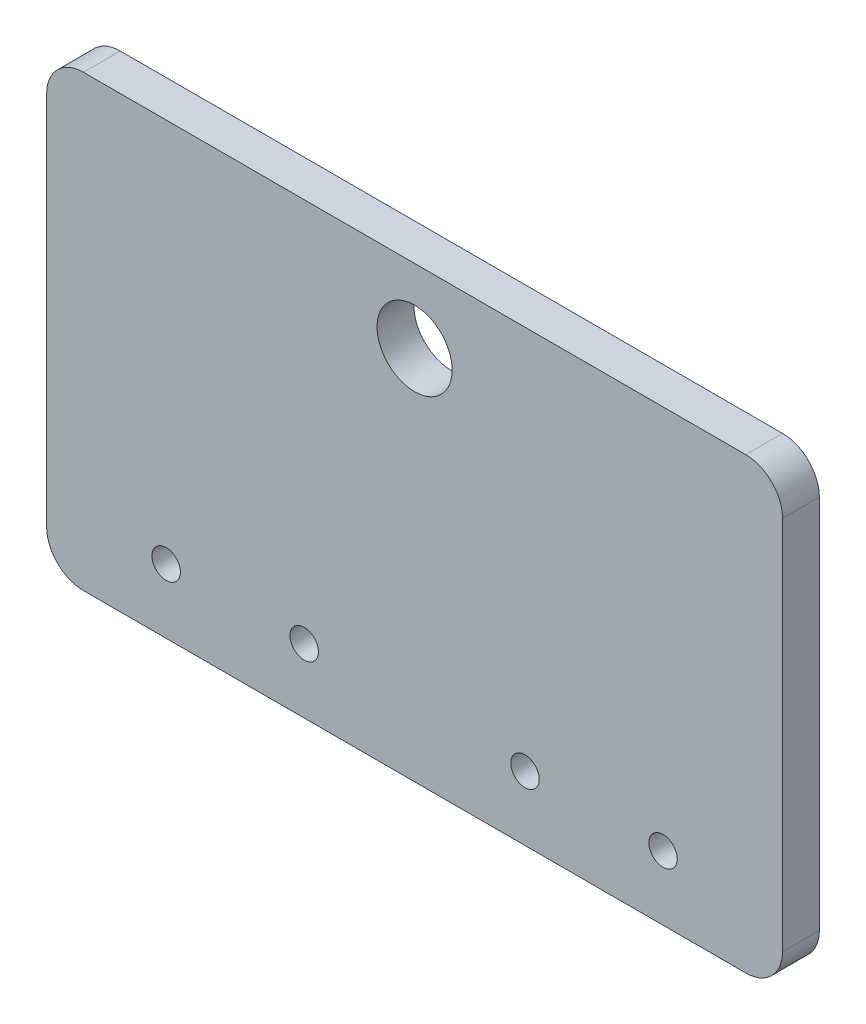
ISO-10303-21;
HEADER;
FILE_DESCRIPTION(('STEP AP214'),'2;1');
FILE_NAME('part.step','',(''),(''),'','','');
FILE_SCHEMA(('AUTOMOTIVE_DESIGN { 1 0 10303 214 1 1 1 1 }'));
ENDSEC;
DATA;
#1=APPLICATION_CONTEXT('core data for automotive mechanical design processes');
#2=APPLICATION_PROTOCOL_DEFINITION('international standard','automotive_design',2000,#1);
#3=PRODUCT_CONTEXT('',#1,'mechanical');
#4=PRODUCT('Part','Part','',(#3));
#5=PRODUCT_RELATED_PRODUCT_CATEGORY('part','',(#4));
#6=PRODUCT_DEFINITION_FORMATION('','',#4);
#7=PRODUCT_DEFINITION_CONTEXT('part definition',#1,'design');
#8=PRODUCT_DEFINITION('design','',#6,#7);
#9=PRODUCT_DEFINITION_SHAPE('','',#8);
#10=(LENGTH_UNIT() NAMED_UNIT(*) SI_UNIT(.MILLI.,.METRE.));
#11=(NAMED_UNIT(*) PLANE_ANGLE_UNIT() SI_UNIT($,.RADIAN.));
#12=(NAMED_UNIT(*) SI_UNIT($,.STERADIAN.) SOLID_ANGLE_UNIT());
#13=UNCERTAINTY_MEASURE_WITH_UNIT(LENGTH_MEASURE(1.E-05),#10,'distance_accuracy_value','');
#14=(GEOMETRIC_REPRESENTATION_CONTEXT(3) GLOBAL_UNCERTAINTY_ASSIGNED_CONTEXT((#13)) GLOBAL_UNIT_ASSIGNED_CONTEXT((#10,
#11,#12)) REPRESENTATION_CONTEXT('',''));
#15=CARTESIAN_POINT('',(0.,0.,0.));
#16=DIRECTION('',(0.,0.,1.));
#17=DIRECTION('',(1.,0.,0.));
#18=AXIS2_PLACEMENT_3D('',#15,#16,#17);
#19=CARTESIAN_POINT('',(0.,0.,0.));
#20=DIRECTION('',(0.,0.,-1.));
#21=DIRECTION('',(-1.,0.,0.));
#22=AXIS2_PLACEMENT_3D('',#19,#20,#21);
#23=PLANE('',#22);
#24=CARTESIAN_POINT('',(63.5,64.77,0.));
#25=DIRECTION('',(0.,0.,1.));
#26=DIRECTION('',(1.,0.,0.));
#27=AXIS2_PLACEMENT_3D('',#24,#25,#26);
#28=CIRCLE('',#27,6.477);
#29=CARTESIAN_POINT('',(69.977,64.77,0.));
#30=VERTEX_POINT('',#29);
#31=EDGE_CURVE('E210',#30,#30,#28,.T.);
#32=ORIENTED_EDGE('',*,*,#31,.T.);
#33=EDGE_LOOP('',(#32));
#34=FACE_BOUND('',#33,.T.);
#35=CARTESIAN_POINT('',(20.6248,11.1125,0.));
#36=DIRECTION('',(0.,0.,1.));
#37=DIRECTION('',(1.,0.,0.));
#38=AXIS2_PLACEMENT_3D('',#35,#36,#37);
#39=CIRCLE('',#38,2.45745);
#40=CARTESIAN_POINT('',(23.08225,11.1125,0.));
#41=VERTEX_POINT('',#40);
#42=EDGE_CURVE('E204',#41,#41,#39,.T.);
#43=ORIENTED_EDGE('',*,*,#42,.T.);
#44=EDGE_LOOP('',(#43));
#45=FACE_BOUND('',#44,.T.);
#46=DIRECTION('',(0.,1.,0.));
#47=VECTOR('',#46,1.);
#48=CARTESIAN_POINT('',(127.,77.47,0.));
#49=LINE('',#48,#47);
#50=CARTESIAN_POINT('',(127.,6.34999999999999,0.));
#51=VERTEX_POINT('',#50);
#52=CARTESIAN_POINT('',(127.,71.12,0.));
#53=VERTEX_POINT('',#52);
#54=EDGE_CURVE('E127',#51,#53,#49,.T.);
#55=ORIENTED_EDGE('',*,*,#54,.F.);
#56=CARTESIAN_POINT('',(120.65,6.34999999999999,0.));
#57=DIRECTION('',(0.,0.,-1.));
#58=DIRECTION('',(-1.,0.,0.));
#59=AXIS2_PLACEMENT_3D('',#56,#57,#58);
#60=CIRCLE('',#59,6.35);
#61=CARTESIAN_POINT('',(120.65,0.,0.));
#62=VERTEX_POINT('',#61);
#63=EDGE_CURVE('E110',#51,#62,#60,.T.);
#64=ORIENTED_EDGE('',*,*,#63,.T.);
#65=DIRECTION('',(1.,0.,0.));
#66=VECTOR('',#65,1.);
#67=CARTESIAN_POINT('',(127.,0.,0.));
#68=LINE('',#67,#66);
#69=CARTESIAN_POINT('',(6.34999999999999,0.,0.));
#70=VERTEX_POINT('',#69);
#71=EDGE_CURVE('E136',#70,#62,#68,.T.);
#72=ORIENTED_EDGE('',*,*,#71,.F.);
#73=CARTESIAN_POINT('',(6.34999999999999,6.35,0.));
#74=DIRECTION('',(0.,0.,-1.));
#75=DIRECTION('',(-1.,0.,0.));
#76=AXIS2_PLACEMENT_3D('',#73,#74,#75);
#77=CIRCLE('',#76,6.35);
#78=CARTESIAN_POINT('',(0.,6.34999999999999,0.));
#79=VERTEX_POINT('',#78);
#80=EDGE_CURVE('E130',#70,#79,#77,.T.);
#81=ORIENTED_EDGE('',*,*,#80,.T.);
#82=DIRECTION('',(0.,-1.,0.));
#83=VECTOR('',#82,1.);
#84=CARTESIAN_POINT('',(0.,77.47,0.));
#85=LINE('',#84,#83);
#86=CARTESIAN_POINT('',(0.,71.12,0.));
#87=VERTEX_POINT('',#86);
#88=EDGE_CURVE('E140',#87,#79,#85,.T.);
#89=ORIENTED_EDGE('',*,*,#88,.F.);
#90=CARTESIAN_POINT('',(6.35,71.12,0.));
#91=DIRECTION('',(0.,0.,-1.));
#92=DIRECTION('',(-1.,0.,0.));
#93=AXIS2_PLACEMENT_3D('',#90,#91,#92);
#94=CIRCLE('',#93,6.35);
#95=CARTESIAN_POINT('',(6.34999999999999,77.47,0.));
#96=VERTEX_POINT('',#95);
#97=EDGE_CURVE('E147',#87,#96,#94,.T.);
#98=ORIENTED_EDGE('',*,*,#97,.T.);
#99=DIRECTION('',(-1.,0.,0.));
#100=VECTOR('',#99,1.);
#101=CARTESIAN_POINT('',(127.,77.47,0.));
#102=LINE('',#101,#100);
#103=CARTESIAN_POINT('',(120.65,77.47,0.));
#104=VERTEX_POINT('',#103);
#105=EDGE_CURVE('E135',#104,#96,#102,.T.);
#106=ORIENTED_EDGE('',*,*,#105,.F.);
#107=CARTESIAN_POINT('',(120.65,71.12,0.));
#108=DIRECTION('',(0.,0.,-1.));
#109=DIRECTION('',(-1.,0.,0.));
#110=AXIS2_PLACEMENT_3D('',#107,#108,#109);
#111=CIRCLE('',#110,6.35);
#112=EDGE_CURVE('E121',#104,#53,#111,.T.);
#113=ORIENTED_EDGE('',*,*,#112,.T.);
#114=EDGE_LOOP('',(#55,#64,#72,#81,#89,#98,#106,#113));
#115=FACE_BOUND('',#114,.T.);
#116=CARTESIAN_POINT('',(106.3752,11.1125,0.));
#117=DIRECTION('',(0.,0.,1.));
#118=DIRECTION('',(1.,0.,0.));
#119=AXIS2_PLACEMENT_3D('',#116,#117,#118);
#120=CIRCLE('',#119,2.45745);
#121=CARTESIAN_POINT('',(108.83265,11.1125,0.));
#122=VERTEX_POINT('',#121);
#123=EDGE_CURVE('E182',#122,#122,#120,.T.);
#124=ORIENTED_EDGE('',*,*,#123,.T.);
#125=EDGE_LOOP('',(#124));
#126=FACE_BOUND('',#125,.T.);
#127=CARTESIAN_POINT('',(82.55,11.1125,0.));
#128=DIRECTION('',(0.,0.,1.));
#129=DIRECTION('',(1.,0.,0.));
#130=AXIS2_PLACEMENT_3D('',#127,#128,#129);
#131=CIRCLE('',#130,2.45745);
#132=CARTESIAN_POINT('',(85.00745,11.1125,0.));
#133=VERTEX_POINT('',#132);
#134=EDGE_CURVE('E192',#133,#133,#131,.T.);
#135=ORIENTED_EDGE('',*,*,#134,.T.);
#136=EDGE_LOOP('',(#135));
#137=FACE_BOUND('',#136,.T.);
#138=CARTESIAN_POINT('',(44.45,11.1125,0.));
#139=DIRECTION('',(0.,0.,1.));
#140=DIRECTION('',(1.,0.,0.));
#141=AXIS2_PLACEMENT_3D('',#138,#139,#140);
#142=CIRCLE('',#141,2.45745);
#143=CARTESIAN_POINT('',(46.90745,11.1125,0.));
#144=VERTEX_POINT('',#143);
#145=EDGE_CURVE('E198',#144,#144,#142,.T.);
#146=ORIENTED_EDGE('',*,*,#145,.T.);
#147=EDGE_LOOP('',(#146));
#148=FACE_BOUND('',#147,.T.);
#149=ADVANCED_FACE('F43',(#34,#45,#115,#126,#137,#148),#23,.T.);
#150=CARTESIAN_POINT('',(0.,77.47,6.35));
#151=DIRECTION('',(1.,0.,0.));
#152=DIRECTION('',(0.,1.,0.));
#153=AXIS2_PLACEMENT_3D('',#150,#151,#152);
#154=PLANE('',#153);
#155=DIRECTION('',(0.,-1.,0.));
#156=VECTOR('',#155,1.);
#157=CARTESIAN_POINT('',(0.,77.47,6.35));
#158=LINE('',#157,#156);
#159=CARTESIAN_POINT('',(0.,71.12,6.35));
#160=VERTEX_POINT('',#159);
#161=CARTESIAN_POINT('',(0.,6.34999999999999,6.35));
#162=VERTEX_POINT('',#161);
#163=EDGE_CURVE('E138',#160,#162,#158,.T.);
#164=ORIENTED_EDGE('',*,*,#163,.F.);
#165=DIRECTION('',(0.,0.,-1.));
#166=VECTOR('',#165,1.);
#167=CARTESIAN_POINT('',(0.,71.12,6.35));
#168=LINE('',#167,#166);
#169=EDGE_CURVE('E11',#160,#87,#168,.T.);
#170=ORIENTED_EDGE('',*,*,#169,.T.);
#171=ORIENTED_EDGE('',*,*,#88,.T.);
#172=DIRECTION('',(0.,0.,-1.));
#173=VECTOR('',#172,1.);
#174=CARTESIAN_POINT('',(0.,6.34999999999999,6.35));
#175=LINE('',#174,#173);
#176=EDGE_CURVE('E51',#79,#162,#175,.F.);
#177=ORIENTED_EDGE('',*,*,#176,.T.);
#178=EDGE_LOOP('',(#164,#170,#171,#177));
#179=FACE_BOUND('',#178,.T.);
#180=ADVANCED_FACE('F168',(#179),#154,.F.);
#181=CARTESIAN_POINT('',(127.,0.,6.35));
#182=DIRECTION('',(0.,1.,0.));
#183=DIRECTION('',(-1.,0.,0.));
#184=AXIS2_PLACEMENT_3D('',#181,#182,#183);
#185=PLANE('',#184);
#186=ORIENTED_EDGE('',*,*,#71,.T.);
#187=DIRECTION('',(0.,0.,-1.));
#188=VECTOR('',#187,1.);
#189=CARTESIAN_POINT('',(120.65,0.,6.35));
#190=LINE('',#189,#188);
#191=CARTESIAN_POINT('',(120.65,0.,6.35));
#192=VERTEX_POINT('',#191);
#193=EDGE_CURVE('E115',#62,#192,#190,.F.);
#194=ORIENTED_EDGE('',*,*,#193,.T.);
#195=DIRECTION('',(1.,0.,0.));
#196=VECTOR('',#195,1.);
#197=CARTESIAN_POINT('',(127.,0.,6.35));
#198=LINE('',#197,#196);
#199=CARTESIAN_POINT('',(6.34999999999999,0.,6.35));
#200=VERTEX_POINT('',#199);
#201=EDGE_CURVE('E177',#200,#192,#198,.T.);
#202=ORIENTED_EDGE('',*,*,#201,.F.);
#203=DIRECTION('',(0.,0.,-1.));
#204=VECTOR('',#203,1.);
#205=CARTESIAN_POINT('',(6.34999999999999,0.,6.35));
#206=LINE('',#205,#204);
#207=EDGE_CURVE('E120',#200,#70,#206,.T.);
#208=ORIENTED_EDGE('',*,*,#207,.T.);
#209=EDGE_LOOP('',(#186,#194,#202,#208));
#210=FACE_BOUND('',#209,.T.);
#211=ADVANCED_FACE('F181',(#210),#185,.F.);
#212=CARTESIAN_POINT('',(127.,77.47,6.35));
#213=DIRECTION('',(-1.,0.,0.));
#214=DIRECTION('',(0.,0.,1.));
#215=AXIS2_PLACEMENT_3D('',#212,#213,#214);
#216=PLANE('',#215);
#217=DIRECTION('',(0.,1.,0.));
#218=VECTOR('',#217,1.);
#219=CARTESIAN_POINT('',(127.,77.47,6.35));
#220=LINE('',#219,#218);
#221=CARTESIAN_POINT('',(127.,6.34999999999999,6.35));
#222=VERTEX_POINT('',#221);
#223=CARTESIAN_POINT('',(127.,71.12,6.35));
#224=VERTEX_POINT('',#223);
#225=EDGE_CURVE('E129',#222,#224,#220,.T.);
#226=ORIENTED_EDGE('',*,*,#225,.F.);
#227=DIRECTION('',(0.,0.,-1.));
#228=VECTOR('',#227,1.);
#229=CARTESIAN_POINT('',(127.,6.34999999999999,6.35));
#230=LINE('',#229,#228);
#231=EDGE_CURVE('E114',#222,#51,#230,.T.);
#232=ORIENTED_EDGE('',*,*,#231,.T.);
#233=ORIENTED_EDGE('',*,*,#54,.T.);
#234=DIRECTION('',(0.,0.,-1.));
#235=VECTOR('',#234,1.);
#236=CARTESIAN_POINT('',(127.,71.12,6.35));
#237=LINE('',#236,#235);
#238=EDGE_CURVE('E131',#53,#224,#237,.F.);
#239=ORIENTED_EDGE('',*,*,#238,.T.);
#240=EDGE_LOOP('',(#226,#232,#233,#239));
#241=FACE_BOUND('',#240,.T.);
#242=ADVANCED_FACE('F126',(#241),#216,.F.);
#243=CARTESIAN_POINT('',(127.,77.47,6.35));
#244=DIRECTION('',(0.,-1.,0.));
#245=DIRECTION('',(1.,0.,0.));
#246=AXIS2_PLACEMENT_3D('',#243,#244,#245);
#247=PLANE('',#246);
#248=DIRECTION('',(-1.,0.,0.));
#249=VECTOR('',#248,1.);
#250=CARTESIAN_POINT('',(127.,77.47,6.35));
#251=LINE('',#250,#249);
#252=CARTESIAN_POINT('',(120.65,77.47,6.35));
#253=VERTEX_POINT('',#252);
#254=CARTESIAN_POINT('',(6.34999999999999,77.47,6.35));
#255=VERTEX_POINT('',#254);
#256=EDGE_CURVE('E144',#253,#255,#251,.T.);
#257=ORIENTED_EDGE('',*,*,#256,.F.);
#258=DIRECTION('',(0.,0.,-1.));
#259=VECTOR('',#258,1.);
#260=CARTESIAN_POINT('',(120.65,77.47,6.35));
#261=LINE('',#260,#259);
#262=EDGE_CURVE('E161',#253,#104,#261,.T.);
#263=ORIENTED_EDGE('',*,*,#262,.T.);
#264=ORIENTED_EDGE('',*,*,#105,.T.);
#265=DIRECTION('',(0.,0.,-1.));
#266=VECTOR('',#265,1.);
#267=CARTESIAN_POINT('',(6.34999999999999,77.47,6.35));
#268=LINE('',#267,#266);
#269=EDGE_CURVE('E58',#96,#255,#268,.F.);
#270=ORIENTED_EDGE('',*,*,#269,.T.);
#271=EDGE_LOOP('',(#257,#263,#264,#270));
#272=FACE_BOUND('',#271,.T.);
#273=ADVANCED_FACE('F228',(#272),#247,.F.);
#274=CARTESIAN_POINT('',(0.,0.,6.35));
#275=DIRECTION('',(0.,0.,-1.));
#276=DIRECTION('',(-1.,0.,0.));
#277=AXIS2_PLACEMENT_3D('',#274,#275,#276);
#278=PLANE('',#277);
#279=CARTESIAN_POINT('',(63.5,64.77,6.35));
#280=DIRECTION('',(0.,0.,1.));
#281=DIRECTION('',(1.,0.,0.));
#282=AXIS2_PLACEMENT_3D('',#279,#280,#281);
#283=CIRCLE('',#282,6.477);
#284=CARTESIAN_POINT('',(69.977,64.77,6.35));
#285=VERTEX_POINT('',#284);
#286=EDGE_CURVE('E211',#285,#285,#283,.T.);
#287=ORIENTED_EDGE('',*,*,#286,.F.);
#288=EDGE_LOOP('',(#287));
#289=FACE_BOUND('',#288,.T.);
#290=CARTESIAN_POINT('',(20.6248,11.1125,6.35));
#291=DIRECTION('',(0.,0.,1.));
#292=DIRECTION('',(1.,0.,0.));
#293=AXIS2_PLACEMENT_3D('',#290,#291,#292);
#294=CIRCLE('',#293,2.45745);
#295=CARTESIAN_POINT('',(23.08225,11.1125,6.35));
#296=VERTEX_POINT('',#295);
#297=EDGE_CURVE('E207',#296,#296,#294,.T.);
#298=ORIENTED_EDGE('',*,*,#297,.F.);
#299=EDGE_LOOP('',(#298));
#300=FACE_BOUND('',#299,.T.);
#301=CARTESIAN_POINT('',(44.45,11.1125,6.35));
#302=DIRECTION('',(0.,0.,1.));
#303=DIRECTION('',(1.,0.,0.));
#304=AXIS2_PLACEMENT_3D('',#301,#302,#303);
#305=CIRCLE('',#304,2.45745);
#306=CARTESIAN_POINT('',(46.90745,11.1125,6.35));
#307=VERTEX_POINT('',#306);
#308=EDGE_CURVE('E201',#307,#307,#305,.T.);
#309=ORIENTED_EDGE('',*,*,#308,.F.);
#310=EDGE_LOOP('',(#309));
#311=FACE_BOUND('',#310,.T.);
#312=CARTESIAN_POINT('',(82.55,11.1125,6.35));
#313=DIRECTION('',(0.,0.,1.));
#314=DIRECTION('',(1.,0.,0.));
#315=AXIS2_PLACEMENT_3D('',#312,#313,#314);
#316=CIRCLE('',#315,2.45745);
#317=CARTESIAN_POINT('',(85.00745,11.1125,6.35));
#318=VERTEX_POINT('',#317);
#319=EDGE_CURVE('E195',#318,#318,#316,.T.);
#320=ORIENTED_EDGE('',*,*,#319,.F.);
#321=EDGE_LOOP('',(#320));
#322=FACE_BOUND('',#321,.T.);
#323=CARTESIAN_POINT('',(106.3752,11.1125,6.35));
#324=DIRECTION('',(0.,0.,1.));
#325=DIRECTION('',(1.,0.,0.));
#326=AXIS2_PLACEMENT_3D('',#323,#324,#325);
#327=CIRCLE('',#326,2.45745);
#328=CARTESIAN_POINT('',(108.83265,11.1125,6.35));
#329=VERTEX_POINT('',#328);
#330=EDGE_CURVE('E184',#329,#329,#327,.T.);
#331=ORIENTED_EDGE('',*,*,#330,.F.);
#332=EDGE_LOOP('',(#331));
#333=FACE_BOUND('',#332,.T.);
#334=ORIENTED_EDGE('',*,*,#201,.T.);
#335=CARTESIAN_POINT('',(120.65,6.34999999999999,6.35));
#336=DIRECTION('',(0.,0.,-1.));
#337=DIRECTION('',(-1.,0.,0.));
#338=AXIS2_PLACEMENT_3D('',#335,#336,#337);
#339=CIRCLE('',#338,6.35);
#340=EDGE_CURVE('E158',#192,#222,#339,.F.);
#341=ORIENTED_EDGE('',*,*,#340,.T.);
#342=ORIENTED_EDGE('',*,*,#225,.T.);
#343=CARTESIAN_POINT('',(120.65,71.12,6.35));
#344=DIRECTION('',(0.,0.,-1.));
#345=DIRECTION('',(-1.,0.,0.));
#346=AXIS2_PLACEMENT_3D('',#343,#344,#345);
#347=CIRCLE('',#346,6.35);
#348=EDGE_CURVE('E65',#224,#253,#347,.F.);
#349=ORIENTED_EDGE('',*,*,#348,.T.);
#350=ORIENTED_EDGE('',*,*,#256,.T.);
#351=CARTESIAN_POINT('',(6.35,71.12,6.35));
#352=DIRECTION('',(0.,0.,-1.));
#353=DIRECTION('',(-1.,0.,0.));
#354=AXIS2_PLACEMENT_3D('',#351,#352,#353);
#355=CIRCLE('',#354,6.35);
#356=EDGE_CURVE('E155',#255,#160,#355,.F.);
#357=ORIENTED_EDGE('',*,*,#356,.T.);
#358=ORIENTED_EDGE('',*,*,#163,.T.);
#359=CARTESIAN_POINT('',(6.34999999999999,6.35,6.35));
#360=DIRECTION('',(0.,0.,-1.));
#361=DIRECTION('',(-1.,0.,0.));
#362=AXIS2_PLACEMENT_3D('',#359,#360,#361);
#363=CIRCLE('',#362,6.35);
#364=EDGE_CURVE('E153',#162,#200,#363,.F.);
#365=ORIENTED_EDGE('',*,*,#364,.T.);
#366=EDGE_LOOP('',(#334,#341,#342,#349,#350,#357,#358,#365));
#367=FACE_BOUND('',#366,.T.);
#368=ADVANCED_FACE('F174',(#289,#300,#311,#322,#333,#367),#278,.F.);
#369=CARTESIAN_POINT('',(106.3752,11.1125,6.35));
#370=DIRECTION('',(0.,0.,1.));
#371=DIRECTION('',(1.,0.,0.));
#372=AXIS2_PLACEMENT_3D('',#369,#370,#371);
#373=CYLINDRICAL_SURFACE('',#372,2.45745);
#374=ORIENTED_EDGE('',*,*,#123,.F.);
#375=EDGE_LOOP('',(#374));
#376=FACE_BOUND('',#375,.T.);
#377=ORIENTED_EDGE('',*,*,#330,.T.);
#378=EDGE_LOOP('',(#377));
#379=FACE_BOUND('',#378,.T.);
#380=ADVANCED_FACE('F227',(#376,#379),#373,.F.);
#381=CARTESIAN_POINT('',(82.55,11.1125,6.35));
#382=DIRECTION('',(0.,0.,1.));
#383=DIRECTION('',(1.,0.,0.));
#384=AXIS2_PLACEMENT_3D('',#381,#382,#383);
#385=CYLINDRICAL_SURFACE('',#384,2.45745);
#386=ORIENTED_EDGE('',*,*,#134,.F.);
#387=EDGE_LOOP('',(#386));
#388=FACE_BOUND('',#387,.T.);
#389=ORIENTED_EDGE('',*,*,#319,.T.);
#390=EDGE_LOOP('',(#389));
#391=FACE_BOUND('',#390,.T.);
#392=ADVANCED_FACE('F239',(#388,#391),#385,.F.);
#393=CARTESIAN_POINT('',(44.45,11.1125,6.35));
#394=DIRECTION('',(0.,0.,1.));
#395=DIRECTION('',(1.,0.,0.));
#396=AXIS2_PLACEMENT_3D('',#393,#394,#395);
#397=CYLINDRICAL_SURFACE('',#396,2.45745);
#398=ORIENTED_EDGE('',*,*,#145,.F.);
#399=EDGE_LOOP('',(#398));
#400=FACE_BOUND('',#399,.T.);
#401=ORIENTED_EDGE('',*,*,#308,.T.);
#402=EDGE_LOOP('',(#401));
#403=FACE_BOUND('',#402,.T.);
#404=ADVANCED_FACE('F246',(#400,#403),#397,.F.);
#405=CARTESIAN_POINT('',(20.6248,11.1125,6.35));
#406=DIRECTION('',(0.,0.,1.));
#407=DIRECTION('',(1.,0.,0.));
#408=AXIS2_PLACEMENT_3D('',#405,#406,#407);
#409=CYLINDRICAL_SURFACE('',#408,2.45745);
#410=ORIENTED_EDGE('',*,*,#42,.F.);
#411=EDGE_LOOP('',(#410));
#412=FACE_BOUND('',#411,.T.);
#413=ORIENTED_EDGE('',*,*,#297,.T.);
#414=EDGE_LOOP('',(#413));
#415=FACE_BOUND('',#414,.T.);
#416=ADVANCED_FACE('F267',(#412,#415),#409,.F.);
#417=CARTESIAN_POINT('',(120.65,6.34999999999999,6.35));
#418=DIRECTION('',(0.,0.,-1.));
#419=DIRECTION('',(-1.,0.,0.));
#420=AXIS2_PLACEMENT_3D('',#417,#418,#419);
#421=CYLINDRICAL_SURFACE('',#420,6.35);
#422=ORIENTED_EDGE('',*,*,#340,.F.);
#423=ORIENTED_EDGE('',*,*,#193,.F.);
#424=ORIENTED_EDGE('',*,*,#63,.F.);
#425=ORIENTED_EDGE('',*,*,#231,.F.);
#426=EDGE_LOOP('',(#422,#423,#424,#425));
#427=FACE_BOUND('',#426,.T.);
#428=ADVANCED_FACE('F113',(#427),#421,.T.);
#429=CARTESIAN_POINT('',(120.65,71.12,6.35));
#430=DIRECTION('',(0.,0.,-1.));
#431=DIRECTION('',(-1.,0.,0.));
#432=AXIS2_PLACEMENT_3D('',#429,#430,#431);
#433=CYLINDRICAL_SURFACE('',#432,6.35);
#434=ORIENTED_EDGE('',*,*,#348,.F.);
#435=ORIENTED_EDGE('',*,*,#238,.F.);
#436=ORIENTED_EDGE('',*,*,#112,.F.);
#437=ORIENTED_EDGE('',*,*,#262,.F.);
#438=EDGE_LOOP('',(#434,#435,#436,#437));
#439=FACE_BOUND('',#438,.T.);
#440=ADVANCED_FACE('F266',(#439),#433,.T.);
#441=CARTESIAN_POINT('',(6.35,71.12,6.35));
#442=DIRECTION('',(0.,0.,-1.));
#443=DIRECTION('',(-1.,0.,0.));
#444=AXIS2_PLACEMENT_3D('',#441,#442,#443);
#445=CYLINDRICAL_SURFACE('',#444,6.35);
#446=ORIENTED_EDGE('',*,*,#356,.F.);
#447=ORIENTED_EDGE('',*,*,#269,.F.);
#448=ORIENTED_EDGE('',*,*,#97,.F.);
#449=ORIENTED_EDGE('',*,*,#169,.F.);
#450=EDGE_LOOP('',(#446,#447,#448,#449));
#451=FACE_BOUND('',#450,.T.);
#452=ADVANCED_FACE('F269',(#451),#445,.T.);
#453=CARTESIAN_POINT('',(6.34999999999999,6.35,6.35));
#454=DIRECTION('',(0.,0.,-1.));
#455=DIRECTION('',(-1.,0.,0.));
#456=AXIS2_PLACEMENT_3D('',#453,#454,#455);
#457=CYLINDRICAL_SURFACE('',#456,6.35);
#458=ORIENTED_EDGE('',*,*,#364,.F.);
#459=ORIENTED_EDGE('',*,*,#176,.F.);
#460=ORIENTED_EDGE('',*,*,#80,.F.);
#461=ORIENTED_EDGE('',*,*,#207,.F.);
#462=EDGE_LOOP('',(#458,#459,#460,#461));
#463=FACE_BOUND('',#462,.T.);
#464=ADVANCED_FACE('F45',(#463),#457,.T.);
#465=CARTESIAN_POINT('',(63.5,64.77,0.));
#466=DIRECTION('',(0.,0.,1.));
#467=DIRECTION('',(1.,0.,0.));
#468=AXIS2_PLACEMENT_3D('',#465,#466,#467);
#469=CYLINDRICAL_SURFACE('',#468,6.477);
#470=ORIENTED_EDGE('',*,*,#31,.F.);
#471=EDGE_LOOP('',(#470));
#472=FACE_BOUND('',#471,.T.);
#473=ORIENTED_EDGE('',*,*,#286,.T.);
#474=EDGE_LOOP('',(#473));
#475=FACE_BOUND('',#474,.T.);
#476=ADVANCED_FACE('F219',(#472,#475),#469,.F.);
#477=CLOSED_SHELL('',(#149,#180,#211,#242,#273,#368,#380,#392,#404,#416,#428,#440,#452,#464,#476));
#478=MANIFOLD_SOLID_BREP('B2',#477);
#479=ADVANCED_BREP_SHAPE_REPRESENTATION('',(#18,#478),#14);
#480=SHAPE_DEFINITION_REPRESENTATION(#9,#479);
ENDSEC;
END-ISO-10303-21;
